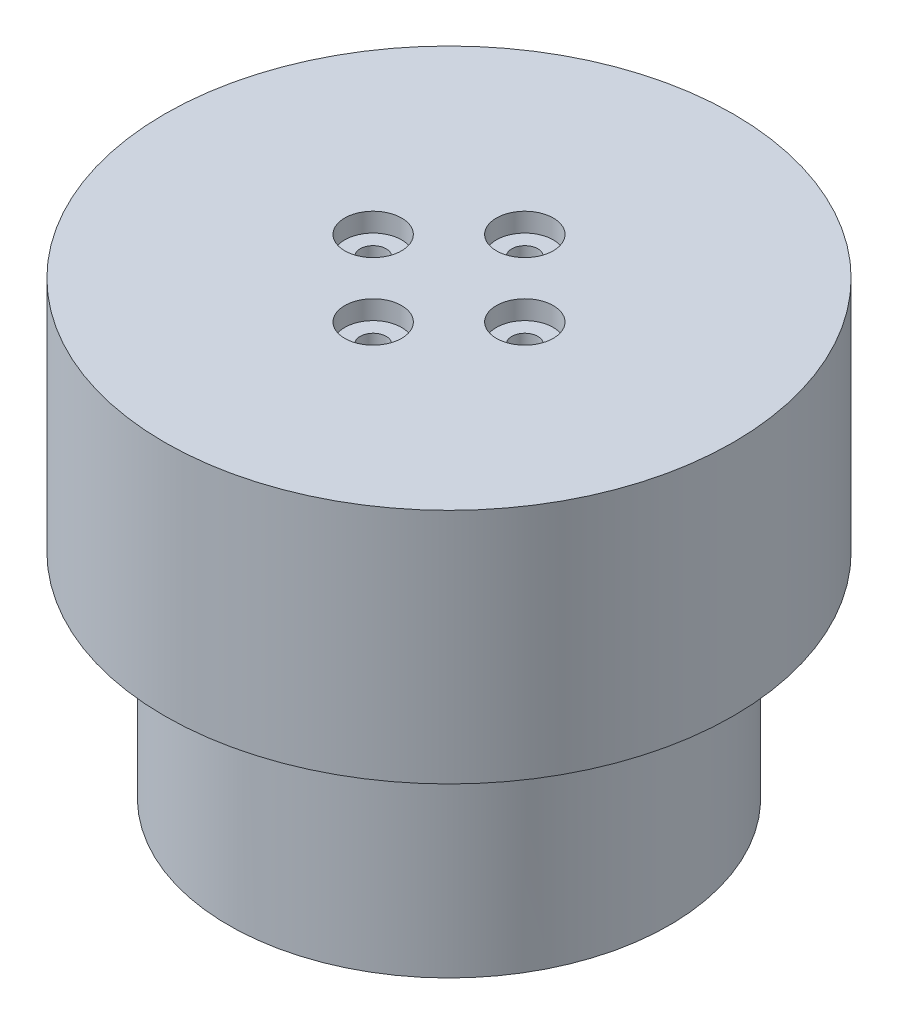
ISO-10303-21;
HEADER;
FILE_DESCRIPTION(('STEP AP214'),'2;1');
FILE_NAME('part.step','',(''),(''),'','','');
FILE_SCHEMA(('AUTOMOTIVE_DESIGN { 1 0 10303 214 1 1 1 1 }'));
ENDSEC;
DATA;
#1=APPLICATION_CONTEXT('core data for automotive mechanical design processes');
#2=APPLICATION_PROTOCOL_DEFINITION('international standard','automotive_design',2000,#1);
#3=PRODUCT_CONTEXT('',#1,'mechanical');
#4=PRODUCT('Part','Part','',(#3));
#5=PRODUCT_RELATED_PRODUCT_CATEGORY('part','',(#4));
#6=PRODUCT_DEFINITION_FORMATION('','',#4);
#7=PRODUCT_DEFINITION_CONTEXT('part definition',#1,'design');
#8=PRODUCT_DEFINITION('design','',#6,#7);
#9=PRODUCT_DEFINITION_SHAPE('','',#8);
#10=(LENGTH_UNIT() NAMED_UNIT(*) SI_UNIT(.MILLI.,.METRE.));
#11=(NAMED_UNIT(*) PLANE_ANGLE_UNIT() SI_UNIT($,.RADIAN.));
#12=(NAMED_UNIT(*) SI_UNIT($,.STERADIAN.) SOLID_ANGLE_UNIT());
#13=UNCERTAINTY_MEASURE_WITH_UNIT(LENGTH_MEASURE(1.E-05),#10,'distance_accuracy_value','');
#14=(GEOMETRIC_REPRESENTATION_CONTEXT(3) GLOBAL_UNCERTAINTY_ASSIGNED_CONTEXT((#13)) GLOBAL_UNIT_ASSIGNED_CONTEXT((#10,
#11,#12)) REPRESENTATION_CONTEXT('',''));
#15=CARTESIAN_POINT('',(0.,0.,0.));
#16=DIRECTION('',(0.,0.,1.));
#17=DIRECTION('',(1.,0.,0.));
#18=AXIS2_PLACEMENT_3D('',#15,#16,#17);
#19=CARTESIAN_POINT('',(-16.,0.,0.));
#20=DIRECTION('',(0.,1.,0.));
#21=DIRECTION('',(0.,0.,1.));
#22=AXIS2_PLACEMENT_3D('',#19,#20,#21);
#23=CYLINDRICAL_SURFACE('',#22,2.75);
#24=CARTESIAN_POINT('',(-16.,20.,0.));
#25=DIRECTION('',(0.,-1.,0.));
#26=DIRECTION('',(0.,0.,-1.));
#27=AXIS2_PLACEMENT_3D('',#24,#25,#26);
#28=CIRCLE('',#27,2.75);
#29=CARTESIAN_POINT('',(-16.,20.,-2.75));
#30=VERTEX_POINT('',#29);
#31=EDGE_CURVE('E57',#30,#30,#28,.T.);
#32=ORIENTED_EDGE('',*,*,#31,.T.);
#33=EDGE_LOOP('',(#32));
#34=FACE_BOUND('',#33,.T.);
#35=CARTESIAN_POINT('',(-16.,91.,0.));
#36=DIRECTION('',(0.,1.,0.));
#37=DIRECTION('',(0.,0.,1.));
#38=AXIS2_PLACEMENT_3D('',#35,#36,#37);
#39=CIRCLE('',#38,2.75);
#40=CARTESIAN_POINT('',(-16.,91.,2.75));
#41=VERTEX_POINT('',#40);
#42=EDGE_CURVE('E42',#41,#41,#39,.F.);
#43=ORIENTED_EDGE('',*,*,#42,.F.);
#44=EDGE_LOOP('',(#43));
#45=FACE_BOUND('',#44,.T.);
#46=ADVANCED_FACE('F38',(#34,#45),#23,.F.);
#47=CARTESIAN_POINT('',(0.,0.,16.));
#48=DIRECTION('',(0.,1.,0.));
#49=DIRECTION('',(0.,0.,1.));
#50=AXIS2_PLACEMENT_3D('',#47,#48,#49);
#51=CYLINDRICAL_SURFACE('',#50,2.75);
#52=CARTESIAN_POINT('',(0.,20.,16.));
#53=DIRECTION('',(0.,-1.,0.));
#54=DIRECTION('',(0.,0.,-1.));
#55=AXIS2_PLACEMENT_3D('',#52,#53,#54);
#56=CIRCLE('',#55,2.75);
#57=CARTESIAN_POINT('',(0.,20.,13.25));
#58=VERTEX_POINT('',#57);
#59=EDGE_CURVE('E62',#58,#58,#56,.T.);
#60=ORIENTED_EDGE('',*,*,#59,.T.);
#61=EDGE_LOOP('',(#60));
#62=FACE_BOUND('',#61,.T.);
#63=CARTESIAN_POINT('',(0.,91.,16.));
#64=DIRECTION('',(0.,1.,0.));
#65=DIRECTION('',(0.,0.,1.));
#66=AXIS2_PLACEMENT_3D('',#63,#64,#65);
#67=CIRCLE('',#66,2.75);
#68=CARTESIAN_POINT('',(0.,91.,18.75));
#69=VERTEX_POINT('',#68);
#70=EDGE_CURVE('E81',#69,#69,#67,.F.);
#71=ORIENTED_EDGE('',*,*,#70,.F.);
#72=EDGE_LOOP('',(#71));
#73=FACE_BOUND('',#72,.T.);
#74=ADVANCED_FACE('F127',(#62,#73),#51,.F.);
#75=CARTESIAN_POINT('',(16.,0.,0.));
#76=DIRECTION('',(0.,1.,0.));
#77=DIRECTION('',(0.,0.,1.));
#78=AXIS2_PLACEMENT_3D('',#75,#76,#77);
#79=CYLINDRICAL_SURFACE('',#78,2.75);
#80=CARTESIAN_POINT('',(16.,20.,0.));
#81=DIRECTION('',(0.,-1.,0.));
#82=DIRECTION('',(0.,0.,-1.));
#83=AXIS2_PLACEMENT_3D('',#80,#81,#82);
#84=CIRCLE('',#83,2.75);
#85=CARTESIAN_POINT('',(16.,20.,-2.75));
#86=VERTEX_POINT('',#85);
#87=EDGE_CURVE('E65',#86,#86,#84,.T.);
#88=ORIENTED_EDGE('',*,*,#87,.T.);
#89=EDGE_LOOP('',(#88));
#90=FACE_BOUND('',#89,.T.);
#91=CARTESIAN_POINT('',(16.,91.,0.));
#92=DIRECTION('',(0.,1.,0.));
#93=DIRECTION('',(0.,0.,1.));
#94=AXIS2_PLACEMENT_3D('',#91,#92,#93);
#95=CIRCLE('',#94,2.75);
#96=CARTESIAN_POINT('',(16.,91.,2.75));
#97=VERTEX_POINT('',#96);
#98=EDGE_CURVE('E78',#97,#97,#95,.F.);
#99=ORIENTED_EDGE('',*,*,#98,.F.);
#100=EDGE_LOOP('',(#99));
#101=FACE_BOUND('',#100,.T.);
#102=ADVANCED_FACE('F133',(#90,#101),#79,.F.);
#103=CARTESIAN_POINT('',(0.,0.,-16.));
#104=DIRECTION('',(0.,1.,0.));
#105=DIRECTION('',(0.,0.,1.));
#106=AXIS2_PLACEMENT_3D('',#103,#104,#105);
#107=CYLINDRICAL_SURFACE('',#106,2.75);
#108=CARTESIAN_POINT('',(0.,20.,-16.));
#109=DIRECTION('',(0.,-1.,0.));
#110=DIRECTION('',(0.,0.,-1.));
#111=AXIS2_PLACEMENT_3D('',#108,#109,#110);
#112=CIRCLE('',#111,2.75);
#113=CARTESIAN_POINT('',(0.,20.,-18.75));
#114=VERTEX_POINT('',#113);
#115=EDGE_CURVE('E61',#114,#114,#112,.T.);
#116=ORIENTED_EDGE('',*,*,#115,.T.);
#117=EDGE_LOOP('',(#116));
#118=FACE_BOUND('',#117,.T.);
#119=CARTESIAN_POINT('',(0.,91.,-16.));
#120=DIRECTION('',(0.,1.,0.));
#121=DIRECTION('',(0.,0.,1.));
#122=AXIS2_PLACEMENT_3D('',#119,#120,#121);
#123=CIRCLE('',#122,2.75);
#124=CARTESIAN_POINT('',(0.,91.,-13.25));
#125=VERTEX_POINT('',#124);
#126=EDGE_CURVE('E75',#125,#125,#123,.F.);
#127=ORIENTED_EDGE('',*,*,#126,.F.);
#128=EDGE_LOOP('',(#127));
#129=FACE_BOUND('',#128,.T.);
#130=ADVANCED_FACE('F310',(#118,#129),#107,.F.);
#131=CARTESIAN_POINT('',(0.,50.,0.));
#132=DIRECTION('',(0.,-1.,0.));
#133=DIRECTION('',(0.,0.,-1.));
#134=AXIS2_PLACEMENT_3D('',#131,#132,#133);
#135=CYLINDRICAL_SURFACE('',#134,46.5);
#136=CARTESIAN_POINT('',(0.,0.,0.));
#137=DIRECTION('',(0.,-1.,0.));
#138=DIRECTION('',(0.,0.,-1.));
#139=AXIS2_PLACEMENT_3D('',#136,#137,#138);
#140=CIRCLE('',#139,46.5);
#141=CARTESIAN_POINT('',(0.,0.,-46.5));
#142=VERTEX_POINT('',#141);
#143=EDGE_CURVE('E66',#142,#142,#140,.T.);
#144=ORIENTED_EDGE('',*,*,#143,.F.);
#145=EDGE_LOOP('',(#144));
#146=FACE_BOUND('',#145,.T.);
#147=CARTESIAN_POINT('',(0.,45.,0.));
#148=DIRECTION('',(0.,1.,0.));
#149=DIRECTION('',(0.,0.,1.));
#150=AXIS2_PLACEMENT_3D('',#147,#148,#149);
#151=CIRCLE('',#150,46.5);
#152=CARTESIAN_POINT('',(0.,45.,46.5));
#153=VERTEX_POINT('',#152);
#154=EDGE_CURVE('E71',#153,#153,#151,.F.);
#155=ORIENTED_EDGE('',*,*,#154,.T.);
#156=EDGE_LOOP('',(#155));
#157=FACE_BOUND('',#156,.T.);
#158=ADVANCED_FACE('F320',(#146,#157),#135,.T.);
#159=CARTESIAN_POINT('',(0.,0.,0.));
#160=DIRECTION('',(0.,1.,0.));
#161=DIRECTION('',(0.,0.,1.));
#162=AXIS2_PLACEMENT_3D('',#159,#160,#161);
#163=PLANE('',#162);
#164=CARTESIAN_POINT('',(0.,0.,0.));
#165=DIRECTION('',(0.,-1.,0.));
#166=DIRECTION('',(0.,0.,-1.));
#167=AXIS2_PLACEMENT_3D('',#164,#165,#166);
#168=CIRCLE('',#167,26.);
#169=CARTESIAN_POINT('',(0.,0.,-26.));
#170=VERTEX_POINT('',#169);
#171=EDGE_CURVE('E46',#170,#170,#168,.T.);
#172=ORIENTED_EDGE('',*,*,#171,.F.);
#173=EDGE_LOOP('',(#172));
#174=FACE_BOUND('',#173,.T.);
#175=ORIENTED_EDGE('',*,*,#143,.T.);
#176=EDGE_LOOP('',(#175));
#177=FACE_BOUND('',#176,.T.);
#178=ADVANCED_FACE('F40',(#174,#177),#163,.F.);
#179=CARTESIAN_POINT('',(0.,20.,0.));
#180=DIRECTION('',(0.,-1.,0.));
#181=DIRECTION('',(0.,0.,-1.));
#182=AXIS2_PLACEMENT_3D('',#179,#180,#181);
#183=CYLINDRICAL_SURFACE('',#182,26.);
#184=CARTESIAN_POINT('',(0.,20.,0.));
#185=DIRECTION('',(0.,-1.,0.));
#186=DIRECTION('',(0.,0.,-1.));
#187=AXIS2_PLACEMENT_3D('',#184,#185,#186);
#188=CIRCLE('',#187,26.);
#189=CARTESIAN_POINT('',(0.,20.,-26.));
#190=VERTEX_POINT('',#189);
#191=EDGE_CURVE('E11',#190,#190,#188,.T.);
#192=ORIENTED_EDGE('',*,*,#191,.F.);
#193=EDGE_LOOP('',(#192));
#194=FACE_BOUND('',#193,.T.);
#195=ORIENTED_EDGE('',*,*,#171,.T.);
#196=EDGE_LOOP('',(#195));
#197=FACE_BOUND('',#196,.T.);
#198=ADVANCED_FACE('F113',(#194,#197),#183,.F.);
#199=CARTESIAN_POINT('',(0.,20.,0.));
#200=DIRECTION('',(0.,-1.,0.));
#201=DIRECTION('',(0.,0.,-1.));
#202=AXIS2_PLACEMENT_3D('',#199,#200,#201);
#203=PLANE('',#202);
#204=ORIENTED_EDGE('',*,*,#115,.F.);
#205=EDGE_LOOP('',(#204));
#206=FACE_BOUND('',#205,.T.);
#207=ORIENTED_EDGE('',*,*,#87,.F.);
#208=EDGE_LOOP('',(#207));
#209=FACE_BOUND('',#208,.T.);
#210=ORIENTED_EDGE('',*,*,#59,.F.);
#211=EDGE_LOOP('',(#210));
#212=FACE_BOUND('',#211,.T.);
#213=ORIENTED_EDGE('',*,*,#31,.F.);
#214=EDGE_LOOP('',(#213));
#215=FACE_BOUND('',#214,.T.);
#216=CARTESIAN_POINT('',(0.,20.,0.));
#217=DIRECTION('',(0.,-1.,0.));
#218=DIRECTION('',(0.,0.,-1.));
#219=AXIS2_PLACEMENT_3D('',#216,#217,#218);
#220=CIRCLE('',#219,11.);
#221=CARTESIAN_POINT('',(0.,20.,-11.));
#222=VERTEX_POINT('',#221);
#223=EDGE_CURVE('E54',#222,#222,#220,.T.);
#224=ORIENTED_EDGE('',*,*,#223,.F.);
#225=EDGE_LOOP('',(#224));
#226=FACE_BOUND('',#225,.T.);
#227=ORIENTED_EDGE('',*,*,#191,.T.);
#228=EDGE_LOOP('',(#227));
#229=FACE_BOUND('',#228,.T.);
#230=ADVANCED_FACE('F111',(#206,#209,#212,#215,#226,#229),#203,.T.);
#231=CARTESIAN_POINT('',(0.,27.5,0.));
#232=DIRECTION('',(0.,-1.,0.));
#233=DIRECTION('',(0.,0.,-1.));
#234=AXIS2_PLACEMENT_3D('',#231,#232,#233);
#235=CYLINDRICAL_SURFACE('',#234,11.);
#236=CARTESIAN_POINT('',(0.,27.5,0.));
#237=DIRECTION('',(0.,-1.,0.));
#238=DIRECTION('',(0.,0.,-1.));
#239=AXIS2_PLACEMENT_3D('',#236,#237,#238);
#240=CIRCLE('',#239,11.);
#241=CARTESIAN_POINT('',(0.,27.5,-11.));
#242=VERTEX_POINT('',#241);
#243=EDGE_CURVE('E51',#242,#242,#240,.T.);
#244=ORIENTED_EDGE('',*,*,#243,.F.);
#245=EDGE_LOOP('',(#244));
#246=FACE_BOUND('',#245,.T.);
#247=ORIENTED_EDGE('',*,*,#223,.T.);
#248=EDGE_LOOP('',(#247));
#249=FACE_BOUND('',#248,.T.);
#250=ADVANCED_FACE('F109',(#246,#249),#235,.F.);
#251=CARTESIAN_POINT('',(0.,27.5,0.));
#252=DIRECTION('',(0.,-1.,0.));
#253=DIRECTION('',(0.,0.,-1.));
#254=AXIS2_PLACEMENT_3D('',#251,#252,#253);
#255=PLANE('',#254);
#256=CARTESIAN_POINT('',(0.,27.5,0.));
#257=DIRECTION('',(0.,-1.,0.));
#258=DIRECTION('',(0.,0.,-1.));
#259=AXIS2_PLACEMENT_3D('',#256,#257,#258);
#260=CIRCLE('',#259,5.);
#261=CARTESIAN_POINT('',(0.,27.5,-5.));
#262=VERTEX_POINT('',#261);
#263=EDGE_CURVE('E60',#262,#262,#260,.T.);
#264=ORIENTED_EDGE('',*,*,#263,.F.);
#265=EDGE_LOOP('',(#264));
#266=FACE_BOUND('',#265,.T.);
#267=ORIENTED_EDGE('',*,*,#243,.T.);
#268=EDGE_LOOP('',(#267));
#269=FACE_BOUND('',#268,.T.);
#270=ADVANCED_FACE('F120',(#266,#269),#255,.T.);
#271=CARTESIAN_POINT('',(0.,41.,0.));
#272=DIRECTION('',(0.,-1.,0.));
#273=DIRECTION('',(0.,0.,-1.));
#274=AXIS2_PLACEMENT_3D('',#271,#272,#273);
#275=CYLINDRICAL_SURFACE('',#274,5.);
#276=CARTESIAN_POINT('',(0.,41.,0.));
#277=DIRECTION('',(0.,-1.,0.));
#278=DIRECTION('',(0.,0.,-1.));
#279=AXIS2_PLACEMENT_3D('',#276,#277,#278);
#280=CIRCLE('',#279,5.);
#281=CARTESIAN_POINT('',(0.,41.,-5.));
#282=VERTEX_POINT('',#281);
#283=EDGE_CURVE('E99',#282,#282,#280,.T.);
#284=ORIENTED_EDGE('',*,*,#283,.F.);
#285=EDGE_LOOP('',(#284));
#286=FACE_BOUND('',#285,.T.);
#287=ORIENTED_EDGE('',*,*,#263,.T.);
#288=EDGE_LOOP('',(#287));
#289=FACE_BOUND('',#288,.T.);
#290=ADVANCED_FACE('F143',(#286,#289),#275,.F.);
#291=CARTESIAN_POINT('',(0.,41.,0.));
#292=DIRECTION('',(0.,-1.,0.));
#293=DIRECTION('',(0.,0.,-1.));
#294=AXIS2_PLACEMENT_3D('',#291,#292,#293);
#295=PLANE('',#294);
#296=ORIENTED_EDGE('',*,*,#283,.T.);
#297=EDGE_LOOP('',(#296));
#298=FACE_BOUND('',#297,.T.);
#299=ADVANCED_FACE('F139',(#298),#295,.T.);
#300=CARTESIAN_POINT('',(0.,45.,0.));
#301=DIRECTION('',(0.,1.,0.));
#302=DIRECTION('',(0.,0.,1.));
#303=AXIS2_PLACEMENT_3D('',#300,#301,#302);
#304=PLANE('',#303);
#305=ORIENTED_EDGE('',*,*,#154,.F.);
#306=EDGE_LOOP('',(#305));
#307=FACE_BOUND('',#306,.T.);
#308=CARTESIAN_POINT('',(0.,45.,0.));
#309=DIRECTION('',(0.,1.,0.));
#310=DIRECTION('',(0.,0.,1.));
#311=AXIS2_PLACEMENT_3D('',#308,#309,#310);
#312=CIRCLE('',#311,60.);
#313=CARTESIAN_POINT('',(0.,45.,60.));
#314=VERTEX_POINT('',#313);
#315=EDGE_CURVE('E86',#314,#314,#312,.T.);
#316=ORIENTED_EDGE('',*,*,#315,.F.);
#317=EDGE_LOOP('',(#316));
#318=FACE_BOUND('',#317,.T.);
#319=ADVANCED_FACE('F142',(#307,#318),#304,.F.);
#320=CARTESIAN_POINT('',(0.,95.,0.));
#321=DIRECTION('',(0.,1.,0.));
#322=DIRECTION('',(0.,0.,1.));
#323=AXIS2_PLACEMENT_3D('',#320,#321,#322);
#324=PLANE('',#323);
#325=CARTESIAN_POINT('',(0.,95.,-16.));
#326=DIRECTION('',(0.,1.,0.));
#327=DIRECTION('',(0.,0.,1.));
#328=AXIS2_PLACEMENT_3D('',#325,#326,#327);
#329=CIRCLE('',#328,6.);
#330=CARTESIAN_POINT('',(0.,95.,-10.));
#331=VERTEX_POINT('',#330);
#332=EDGE_CURVE('E423',#331,#331,#329,.T.);
#333=ORIENTED_EDGE('',*,*,#332,.F.);
#334=EDGE_LOOP('',(#333));
#335=FACE_BOUND('',#334,.T.);
#336=CARTESIAN_POINT('',(16.,95.,0.));
#337=DIRECTION('',(0.,1.,0.));
#338=DIRECTION('',(0.,0.,1.));
#339=AXIS2_PLACEMENT_3D('',#336,#337,#338);
#340=CIRCLE('',#339,6.);
#341=CARTESIAN_POINT('',(16.,95.,6.));
#342=VERTEX_POINT('',#341);
#343=EDGE_CURVE('E424',#342,#342,#340,.T.);
#344=ORIENTED_EDGE('',*,*,#343,.F.);
#345=EDGE_LOOP('',(#344));
#346=FACE_BOUND('',#345,.T.);
#347=CARTESIAN_POINT('',(0.,95.,16.));
#348=DIRECTION('',(0.,1.,0.));
#349=DIRECTION('',(0.,0.,1.));
#350=AXIS2_PLACEMENT_3D('',#347,#348,#349);
#351=CIRCLE('',#350,6.);
#352=CARTESIAN_POINT('',(0.,95.,22.));
#353=VERTEX_POINT('',#352);
#354=EDGE_CURVE('E433',#353,#353,#351,.T.);
#355=ORIENTED_EDGE('',*,*,#354,.F.);
#356=EDGE_LOOP('',(#355));
#357=FACE_BOUND('',#356,.T.);
#358=CARTESIAN_POINT('',(-16.,95.,0.));
#359=DIRECTION('',(0.,1.,0.));
#360=DIRECTION('',(0.,0.,1.));
#361=AXIS2_PLACEMENT_3D('',#358,#359,#360);
#362=CIRCLE('',#361,6.);
#363=CARTESIAN_POINT('',(-16.,95.,6.));
#364=VERTEX_POINT('',#363);
#365=EDGE_CURVE('E439',#364,#364,#362,.T.);
#366=ORIENTED_EDGE('',*,*,#365,.F.);
#367=EDGE_LOOP('',(#366));
#368=FACE_BOUND('',#367,.T.);
#369=CARTESIAN_POINT('',(0.,95.,0.));
#370=DIRECTION('',(0.,1.,0.));
#371=DIRECTION('',(0.,0.,1.));
#372=AXIS2_PLACEMENT_3D('',#369,#370,#371);
#373=CIRCLE('',#372,60.);
#374=CARTESIAN_POINT('',(0.,95.,60.));
#375=VERTEX_POINT('',#374);
#376=EDGE_CURVE('E74',#375,#375,#373,.T.);
#377=ORIENTED_EDGE('',*,*,#376,.T.);
#378=EDGE_LOOP('',(#377));
#379=FACE_BOUND('',#378,.T.);
#380=ADVANCED_FACE('F170',(#335,#346,#357,#368,#379),#324,.T.);
#381=CARTESIAN_POINT('',(0.,95.,0.));
#382=DIRECTION('',(0.,-1.,0.));
#383=DIRECTION('',(0.,0.,-1.));
#384=AXIS2_PLACEMENT_3D('',#381,#382,#383);
#385=CYLINDRICAL_SURFACE('',#384,60.);
#386=ORIENTED_EDGE('',*,*,#376,.F.);
#387=EDGE_LOOP('',(#386));
#388=FACE_BOUND('',#387,.T.);
#389=ORIENTED_EDGE('',*,*,#315,.T.);
#390=EDGE_LOOP('',(#389));
#391=FACE_BOUND('',#390,.T.);
#392=ADVANCED_FACE('F180',(#388,#391),#385,.T.);
#393=CARTESIAN_POINT('',(-16.,91.,0.));
#394=DIRECTION('',(0.,1.,0.));
#395=DIRECTION('',(0.,0.,1.));
#396=AXIS2_PLACEMENT_3D('',#393,#394,#395);
#397=PLANE('',#396);
#398=CARTESIAN_POINT('',(-16.,91.,0.));
#399=DIRECTION('',(0.,1.,0.));
#400=DIRECTION('',(0.,0.,1.));
#401=AXIS2_PLACEMENT_3D('',#398,#399,#400);
#402=CIRCLE('',#401,6.);
#403=CARTESIAN_POINT('',(-16.,91.,6.));
#404=VERTEX_POINT('',#403);
#405=EDGE_CURVE('E441',#404,#404,#402,.T.);
#406=ORIENTED_EDGE('',*,*,#405,.T.);
#407=EDGE_LOOP('',(#406));
#408=FACE_BOUND('',#407,.T.);
#409=ORIENTED_EDGE('',*,*,#42,.T.);
#410=EDGE_LOOP('',(#409));
#411=FACE_BOUND('',#410,.T.);
#412=ADVANCED_FACE('F189',(#408,#411),#397,.T.);
#413=CARTESIAN_POINT('',(-16.,91.,0.));
#414=DIRECTION('',(0.,1.,0.));
#415=DIRECTION('',(0.,0.,1.));
#416=AXIS2_PLACEMENT_3D('',#413,#414,#415);
#417=CYLINDRICAL_SURFACE('',#416,6.);
#418=ORIENTED_EDGE('',*,*,#405,.F.);
#419=EDGE_LOOP('',(#418));
#420=FACE_BOUND('',#419,.T.);
#421=ORIENTED_EDGE('',*,*,#365,.T.);
#422=EDGE_LOOP('',(#421));
#423=FACE_BOUND('',#422,.T.);
#424=ADVANCED_FACE('F196',(#420,#423),#417,.F.);
#425=CARTESIAN_POINT('',(0.,91.,16.));
#426=DIRECTION('',(0.,1.,0.));
#427=DIRECTION('',(0.,0.,1.));
#428=AXIS2_PLACEMENT_3D('',#425,#426,#427);
#429=PLANE('',#428);
#430=CARTESIAN_POINT('',(0.,91.,16.));
#431=DIRECTION('',(0.,1.,0.));
#432=DIRECTION('',(0.,0.,1.));
#433=AXIS2_PLACEMENT_3D('',#430,#431,#432);
#434=CIRCLE('',#433,6.);
#435=CARTESIAN_POINT('',(0.,91.,22.));
#436=VERTEX_POINT('',#435);
#437=EDGE_CURVE('E436',#436,#436,#434,.T.);
#438=ORIENTED_EDGE('',*,*,#437,.T.);
#439=EDGE_LOOP('',(#438));
#440=FACE_BOUND('',#439,.T.);
#441=ORIENTED_EDGE('',*,*,#70,.T.);
#442=EDGE_LOOP('',(#441));
#443=FACE_BOUND('',#442,.T.);
#444=ADVANCED_FACE('F204',(#440,#443),#429,.T.);
#445=CARTESIAN_POINT('',(0.,91.,16.));
#446=DIRECTION('',(0.,1.,0.));
#447=DIRECTION('',(0.,0.,1.));
#448=AXIS2_PLACEMENT_3D('',#445,#446,#447);
#449=CYLINDRICAL_SURFACE('',#448,6.);
#450=ORIENTED_EDGE('',*,*,#437,.F.);
#451=EDGE_LOOP('',(#450));
#452=FACE_BOUND('',#451,.T.);
#453=ORIENTED_EDGE('',*,*,#354,.T.);
#454=EDGE_LOOP('',(#453));
#455=FACE_BOUND('',#454,.T.);
#456=ADVANCED_FACE('F212',(#452,#455),#449,.F.);
#457=CARTESIAN_POINT('',(16.,91.,0.));
#458=DIRECTION('',(0.,1.,0.));
#459=DIRECTION('',(0.,0.,1.));
#460=AXIS2_PLACEMENT_3D('',#457,#458,#459);
#461=PLANE('',#460);
#462=CARTESIAN_POINT('',(16.,91.,0.));
#463=DIRECTION('',(0.,1.,0.));
#464=DIRECTION('',(0.,0.,1.));
#465=AXIS2_PLACEMENT_3D('',#462,#463,#464);
#466=CIRCLE('',#465,6.);
#467=CARTESIAN_POINT('',(16.,91.,6.));
#468=VERTEX_POINT('',#467);
#469=EDGE_CURVE('E428',#468,#468,#466,.T.);
#470=ORIENTED_EDGE('',*,*,#469,.T.);
#471=EDGE_LOOP('',(#470));
#472=FACE_BOUND('',#471,.T.);
#473=ORIENTED_EDGE('',*,*,#98,.T.);
#474=EDGE_LOOP('',(#473));
#475=FACE_BOUND('',#474,.T.);
#476=ADVANCED_FACE('F220',(#472,#475),#461,.T.);
#477=CARTESIAN_POINT('',(16.,91.,0.));
#478=DIRECTION('',(0.,1.,0.));
#479=DIRECTION('',(0.,0.,1.));
#480=AXIS2_PLACEMENT_3D('',#477,#478,#479);
#481=CYLINDRICAL_SURFACE('',#480,6.);
#482=ORIENTED_EDGE('',*,*,#469,.F.);
#483=EDGE_LOOP('',(#482));
#484=FACE_BOUND('',#483,.T.);
#485=ORIENTED_EDGE('',*,*,#343,.T.);
#486=EDGE_LOOP('',(#485));
#487=FACE_BOUND('',#486,.T.);
#488=ADVANCED_FACE('F228',(#484,#487),#481,.F.);
#489=CARTESIAN_POINT('',(0.,91.,-16.));
#490=DIRECTION('',(0.,1.,0.));
#491=DIRECTION('',(0.,0.,1.));
#492=AXIS2_PLACEMENT_3D('',#489,#490,#491);
#493=PLANE('',#492);
#494=CARTESIAN_POINT('',(0.,91.,-16.));
#495=DIRECTION('',(0.,1.,0.));
#496=DIRECTION('',(0.,0.,1.));
#497=AXIS2_PLACEMENT_3D('',#494,#495,#496);
#498=CIRCLE('',#497,6.);
#499=CARTESIAN_POINT('',(0.,91.,-10.));
#500=VERTEX_POINT('',#499);
#501=EDGE_CURVE('E79',#500,#500,#498,.T.);
#502=ORIENTED_EDGE('',*,*,#501,.T.);
#503=EDGE_LOOP('',(#502));
#504=FACE_BOUND('',#503,.T.);
#505=ORIENTED_EDGE('',*,*,#126,.T.);
#506=EDGE_LOOP('',(#505));
#507=FACE_BOUND('',#506,.T.);
#508=ADVANCED_FACE('F236',(#504,#507),#493,.T.);
#509=CARTESIAN_POINT('',(0.,91.,-16.));
#510=DIRECTION('',(0.,1.,0.));
#511=DIRECTION('',(0.,0.,1.));
#512=AXIS2_PLACEMENT_3D('',#509,#510,#511);
#513=CYLINDRICAL_SURFACE('',#512,6.);
#514=ORIENTED_EDGE('',*,*,#501,.F.);
#515=EDGE_LOOP('',(#514));
#516=FACE_BOUND('',#515,.T.);
#517=ORIENTED_EDGE('',*,*,#332,.T.);
#518=EDGE_LOOP('',(#517));
#519=FACE_BOUND('',#518,.T.);
#520=ADVANCED_FACE('F244',(#516,#519),#513,.F.);
#521=CLOSED_SHELL('',(#46,#74,#102,#130,#158,#178,#198,#230,#250,#270,#290,#299,#319,#380,#392,
#412,#424,#444,#456,#476,#488,#508,#520));
#522=MANIFOLD_SOLID_BREP('B2',#521);
#523=ADVANCED_BREP_SHAPE_REPRESENTATION('',(#18,#522),#14);
#524=SHAPE_DEFINITION_REPRESENTATION(#9,#523);
ENDSEC;
END-ISO-10303-21;
